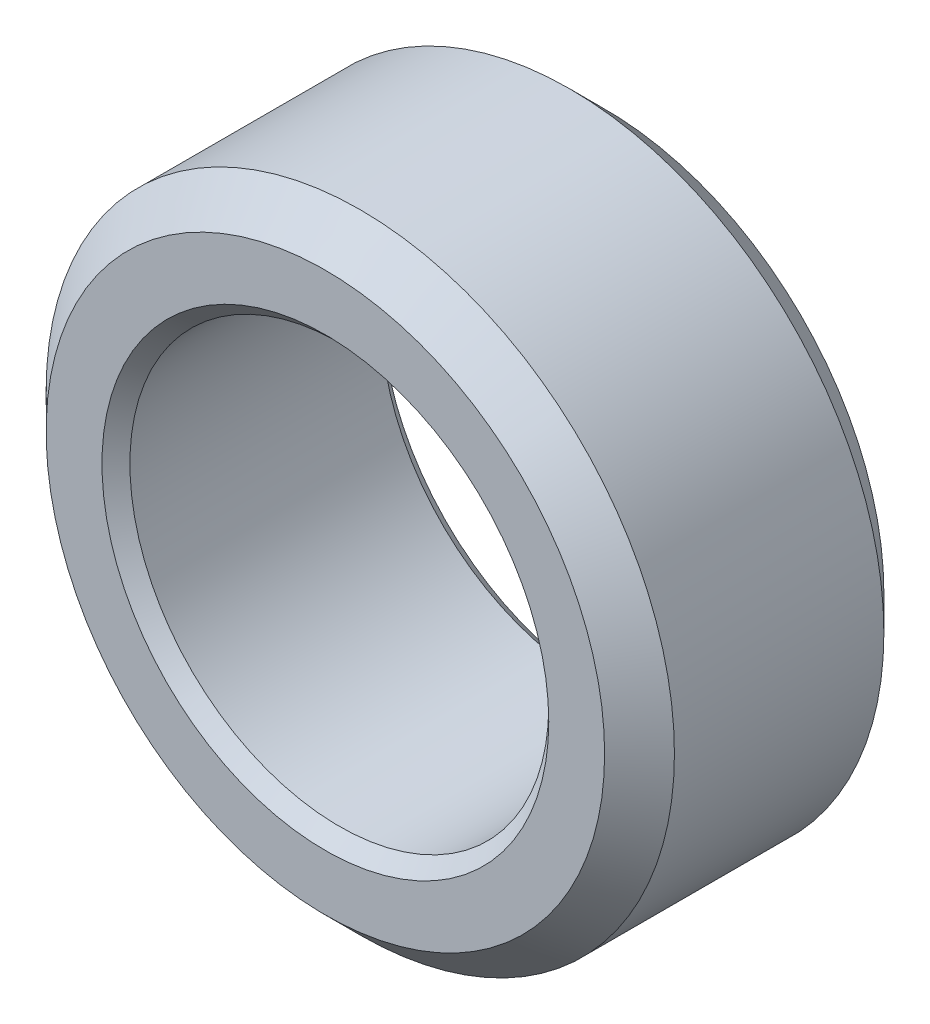
ISO-10303-21;
HEADER;
FILE_DESCRIPTION(('STEP AP214'),'2;1');
FILE_NAME('part.step','',(''),(''),'','','');
FILE_SCHEMA(('AUTOMOTIVE_DESIGN { 1 0 10303 214 1 1 1 1 }'));
ENDSEC;
DATA;
#1=APPLICATION_CONTEXT('core data for automotive mechanical design processes');
#2=APPLICATION_PROTOCOL_DEFINITION('international standard','automotive_design',2000,#1);
#3=PRODUCT_CONTEXT('',#1,'mechanical');
#4=PRODUCT('Part','Part','',(#3));
#5=PRODUCT_RELATED_PRODUCT_CATEGORY('part','',(#4));
#6=PRODUCT_DEFINITION_FORMATION('','',#4);
#7=PRODUCT_DEFINITION_CONTEXT('part definition',#1,'design');
#8=PRODUCT_DEFINITION('design','',#6,#7);
#9=PRODUCT_DEFINITION_SHAPE('','',#8);
#10=(LENGTH_UNIT() NAMED_UNIT(*) SI_UNIT(.MILLI.,.METRE.));
#11=(NAMED_UNIT(*) PLANE_ANGLE_UNIT() SI_UNIT($,.RADIAN.));
#12=(NAMED_UNIT(*) SI_UNIT($,.STERADIAN.) SOLID_ANGLE_UNIT());
#13=UNCERTAINTY_MEASURE_WITH_UNIT(LENGTH_MEASURE(1.E-05),#10,'distance_accuracy_value','');
#14=(GEOMETRIC_REPRESENTATION_CONTEXT(3) GLOBAL_UNCERTAINTY_ASSIGNED_CONTEXT((#13)) GLOBAL_UNIT_ASSIGNED_CONTEXT((#10,
#11,#12)) REPRESENTATION_CONTEXT('',''));
#15=CARTESIAN_POINT('',(0.,0.,0.));
#16=DIRECTION('',(0.,0.,1.));
#17=DIRECTION('',(1.,0.,0.));
#18=AXIS2_PLACEMENT_3D('',#15,#16,#17);
#19=CARTESIAN_POINT('',(0.,0.,2.));
#20=DIRECTION('',(0.,0.,1.));
#21=DIRECTION('',(1.,0.,0.));
#22=AXIS2_PLACEMENT_3D('',#19,#20,#21);
#23=PLANE('',#22);
#24=CARTESIAN_POINT('',(0.,0.,2.));
#25=DIRECTION('',(0.,0.,1.));
#26=DIRECTION('',(1.,0.,0.));
#27=AXIS2_PLACEMENT_3D('',#24,#25,#26);
#28=CIRCLE('',#27,3.2);
#29=CARTESIAN_POINT('',(3.2,0.,2.));
#30=VERTEX_POINT('',#29);
#31=EDGE_CURVE('E10',#30,#30,#28,.F.);
#32=ORIENTED_EDGE('',*,*,#31,.T.);
#33=EDGE_LOOP('',(#32));
#34=FACE_BOUND('',#33,.T.);
#35=CARTESIAN_POINT('',(0.,0.,2.));
#36=DIRECTION('',(0.,0.,1.));
#37=DIRECTION('',(1.,0.,0.));
#38=AXIS2_PLACEMENT_3D('',#35,#36,#37);
#39=CIRCLE('',#38,3.99999999999999);
#40=CARTESIAN_POINT('',(3.99999999999999,0.,2.));
#41=VERTEX_POINT('',#40);
#42=EDGE_CURVE('E60',#41,#41,#39,.T.);
#43=ORIENTED_EDGE('',*,*,#42,.T.);
#44=EDGE_LOOP('',(#43));
#45=FACE_BOUND('',#44,.T.);
#46=ADVANCED_FACE('F31',(#34,#45),#23,.T.);
#47=CARTESIAN_POINT('',(0.,0.,-2.));
#48=DIRECTION('',(0.,0.,1.));
#49=DIRECTION('',(1.,0.,0.));
#50=AXIS2_PLACEMENT_3D('',#47,#48,#49);
#51=PLANE('',#50);
#52=CARTESIAN_POINT('',(0.,0.,-2.));
#53=DIRECTION('',(0.,0.,1.));
#54=DIRECTION('',(1.,0.,0.));
#55=AXIS2_PLACEMENT_3D('',#52,#53,#54);
#56=CIRCLE('',#55,3.2);
#57=CARTESIAN_POINT('',(3.2,0.,-2.));
#58=VERTEX_POINT('',#57);
#59=EDGE_CURVE('E46',#58,#58,#56,.T.);
#60=ORIENTED_EDGE('',*,*,#59,.T.);
#61=EDGE_LOOP('',(#60));
#62=FACE_BOUND('',#61,.T.);
#63=CARTESIAN_POINT('',(0.,0.,-2.));
#64=DIRECTION('',(0.,0.,1.));
#65=DIRECTION('',(1.,0.,0.));
#66=AXIS2_PLACEMENT_3D('',#63,#64,#65);
#67=CIRCLE('',#66,4.);
#68=CARTESIAN_POINT('',(4.,0.,-2.));
#69=VERTEX_POINT('',#68);
#70=EDGE_CURVE('E51',#69,#69,#67,.F.);
#71=ORIENTED_EDGE('',*,*,#70,.T.);
#72=EDGE_LOOP('',(#71));
#73=FACE_BOUND('',#72,.T.);
#74=ADVANCED_FACE('F81',(#62,#73),#51,.F.);
#75=CARTESIAN_POINT('',(0.,0.,2.));
#76=DIRECTION('',(0.,0.,-1.));
#77=DIRECTION('',(-1.,0.,0.));
#78=AXIS2_PLACEMENT_3D('',#75,#76,#77);
#79=CYLINDRICAL_SURFACE('',#78,4.5);
#80=CARTESIAN_POINT('',(0.,0.,1.5));
#81=DIRECTION('',(0.,0.,1.));
#82=DIRECTION('',(1.,0.,0.));
#83=AXIS2_PLACEMENT_3D('',#80,#81,#82);
#84=CIRCLE('',#83,4.5);
#85=CARTESIAN_POINT('',(4.5,0.,1.5));
#86=VERTEX_POINT('',#85);
#87=EDGE_CURVE('E54',#86,#86,#84,.F.);
#88=ORIENTED_EDGE('',*,*,#87,.T.);
#89=EDGE_LOOP('',(#88));
#90=FACE_BOUND('',#89,.T.);
#91=CARTESIAN_POINT('',(0.,0.,-1.49999999999999));
#92=DIRECTION('',(0.,0.,1.));
#93=DIRECTION('',(1.,0.,0.));
#94=AXIS2_PLACEMENT_3D('',#91,#92,#93);
#95=CIRCLE('',#94,4.5);
#96=CARTESIAN_POINT('',(4.5,0.,-1.49999999999999));
#97=VERTEX_POINT('',#96);
#98=EDGE_CURVE('E57',#97,#97,#95,.T.);
#99=ORIENTED_EDGE('',*,*,#98,.T.);
#100=EDGE_LOOP('',(#99));
#101=FACE_BOUND('',#100,.T.);
#102=ADVANCED_FACE('F33',(#90,#101),#79,.T.);
#103=CARTESIAN_POINT('',(0.,0.,2.));
#104=DIRECTION('',(0.,0.,-1.));
#105=DIRECTION('',(-1.,0.,0.));
#106=AXIS2_PLACEMENT_3D('',#103,#104,#105);
#107=CYLINDRICAL_SURFACE('',#106,3.);
#108=CARTESIAN_POINT('',(0.,0.,-1.8));
#109=DIRECTION('',(0.,0.,1.));
#110=DIRECTION('',(1.,0.,0.));
#111=AXIS2_PLACEMENT_3D('',#108,#109,#110);
#112=CIRCLE('',#111,3.);
#113=CARTESIAN_POINT('',(3.,0.,-1.8));
#114=VERTEX_POINT('',#113);
#115=EDGE_CURVE('E38',#114,#114,#112,.F.);
#116=ORIENTED_EDGE('',*,*,#115,.T.);
#117=EDGE_LOOP('',(#116));
#118=FACE_BOUND('',#117,.T.);
#119=CARTESIAN_POINT('',(0.,0.,1.8));
#120=DIRECTION('',(0.,0.,1.));
#121=DIRECTION('',(1.,0.,0.));
#122=AXIS2_PLACEMENT_3D('',#119,#120,#121);
#123=CIRCLE('',#122,3.);
#124=CARTESIAN_POINT('',(3.,0.,1.8));
#125=VERTEX_POINT('',#124);
#126=EDGE_CURVE('E42',#125,#125,#123,.T.);
#127=ORIENTED_EDGE('',*,*,#126,.T.);
#128=EDGE_LOOP('',(#127));
#129=FACE_BOUND('',#128,.T.);
#130=ADVANCED_FACE('F68',(#118,#129),#107,.F.);
#131=CARTESIAN_POINT('',(0.,0.,2.));
#132=DIRECTION('',(0.,0.,-1.));
#133=DIRECTION('',(-1.,0.,0.));
#134=AXIS2_PLACEMENT_3D('',#131,#132,#133);
#135=CONICAL_SURFACE('',#134,3.99999999999999,0.785398163397454);
#136=ORIENTED_EDGE('',*,*,#87,.F.);
#137=EDGE_LOOP('',(#136));
#138=FACE_BOUND('',#137,.T.);
#139=ORIENTED_EDGE('',*,*,#42,.F.);
#140=EDGE_LOOP('',(#139));
#141=FACE_BOUND('',#140,.T.);
#142=ADVANCED_FACE('F65',(#138,#141),#135,.T.);
#143=CARTESIAN_POINT('',(0.,0.,-1.49999999999999));
#144=DIRECTION('',(0.,0.,1.));
#145=DIRECTION('',(1.,0.,0.));
#146=AXIS2_PLACEMENT_3D('',#143,#144,#145);
#147=CONICAL_SURFACE('',#146,4.5,0.785398163397444);
#148=ORIENTED_EDGE('',*,*,#70,.F.);
#149=EDGE_LOOP('',(#148));
#150=FACE_BOUND('',#149,.T.);
#151=ORIENTED_EDGE('',*,*,#98,.F.);
#152=EDGE_LOOP('',(#151));
#153=FACE_BOUND('',#152,.T.);
#154=ADVANCED_FACE('F67',(#150,#153),#147,.T.);
#155=CARTESIAN_POINT('',(0.,0.,-2.));
#156=DIRECTION('',(0.,0.,-1.));
#157=DIRECTION('',(-1.,0.,0.));
#158=AXIS2_PLACEMENT_3D('',#155,#156,#157);
#159=CONICAL_SURFACE('',#158,3.2,0.785398163397454);
#160=ORIENTED_EDGE('',*,*,#115,.F.);
#161=EDGE_LOOP('',(#160));
#162=FACE_BOUND('',#161,.T.);
#163=ORIENTED_EDGE('',*,*,#59,.F.);
#164=EDGE_LOOP('',(#163));
#165=FACE_BOUND('',#164,.T.);
#166=ADVANCED_FACE('F75',(#162,#165),#159,.F.);
#167=CARTESIAN_POINT('',(0.,0.,1.8));
#168=DIRECTION('',(0.,0.,1.));
#169=DIRECTION('',(1.,0.,0.));
#170=AXIS2_PLACEMENT_3D('',#167,#168,#169);
#171=CONICAL_SURFACE('',#170,3.,0.785398163397443);
#172=ORIENTED_EDGE('',*,*,#31,.F.);
#173=EDGE_LOOP('',(#172));
#174=FACE_BOUND('',#173,.T.);
#175=ORIENTED_EDGE('',*,*,#126,.F.);
#176=EDGE_LOOP('',(#175));
#177=FACE_BOUND('',#176,.T.);
#178=ADVANCED_FACE('F99',(#174,#177),#171,.F.);
#179=CLOSED_SHELL('',(#46,#74,#102,#130,#142,#154,#166,#178));
#180=MANIFOLD_SOLID_BREP('B2',#179);
#181=ADVANCED_BREP_SHAPE_REPRESENTATION('',(#18,#180),#14);
#182=SHAPE_DEFINITION_REPRESENTATION(#9,#181);
ENDSEC;
END-ISO-10303-21;
